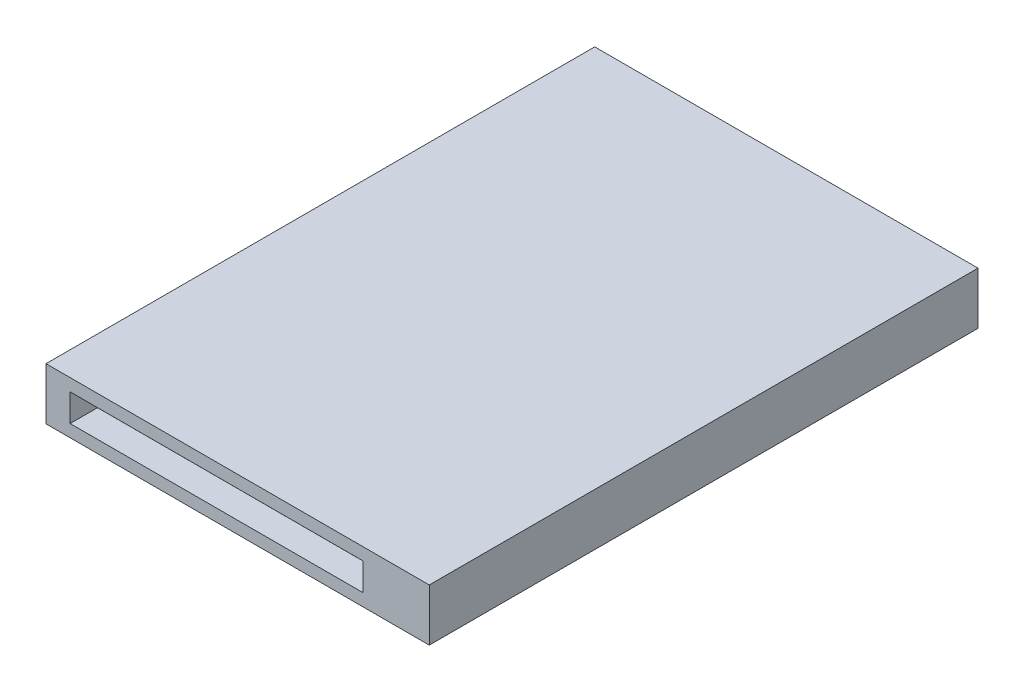
ISO-10303-21;
HEADER;
FILE_DESCRIPTION(('STEP AP214'),'2;1');
FILE_NAME('part.step','',(''),(''),'','','');
FILE_SCHEMA(('AUTOMOTIVE_DESIGN { 1 0 10303 214 1 1 1 1 }'));
ENDSEC;
DATA;
#1=APPLICATION_CONTEXT('core data for automotive mechanical design processes');
#2=APPLICATION_PROTOCOL_DEFINITION('international standard','automotive_design',2000,#1);
#3=PRODUCT_CONTEXT('',#1,'mechanical');
#4=PRODUCT('Part','Part','',(#3));
#5=PRODUCT_RELATED_PRODUCT_CATEGORY('part','',(#4));
#6=PRODUCT_DEFINITION_FORMATION('','',#4);
#7=PRODUCT_DEFINITION_CONTEXT('part definition',#1,'design');
#8=PRODUCT_DEFINITION('design','',#6,#7);
#9=PRODUCT_DEFINITION_SHAPE('','',#8);
#10=(LENGTH_UNIT() NAMED_UNIT(*) SI_UNIT(.MILLI.,.METRE.));
#11=(NAMED_UNIT(*) PLANE_ANGLE_UNIT() SI_UNIT($,.RADIAN.));
#12=(NAMED_UNIT(*) SI_UNIT($,.STERADIAN.) SOLID_ANGLE_UNIT());
#13=UNCERTAINTY_MEASURE_WITH_UNIT(LENGTH_MEASURE(1.E-05),#10,'distance_accuracy_value','');
#14=(GEOMETRIC_REPRESENTATION_CONTEXT(3) GLOBAL_UNCERTAINTY_ASSIGNED_CONTEXT((#13)) GLOBAL_UNIT_ASSIGNED_CONTEXT((#10,
#11,#12)) REPRESENTATION_CONTEXT('',''));
#15=CARTESIAN_POINT('',(0.,0.,0.));
#16=DIRECTION('',(0.,0.,1.));
#17=DIRECTION('',(1.,0.,0.));
#18=AXIS2_PLACEMENT_3D('',#15,#16,#17);
#19=CARTESIAN_POINT('',(-34.925,9.5,-50.));
#20=DIRECTION('',(1.,0.,0.));
#21=DIRECTION('',(0.,0.,-1.));
#22=AXIS2_PLACEMENT_3D('',#19,#20,#21);
#23=PLANE('',#22);
#24=DIRECTION('',(0.,0.,1.));
#25=VECTOR('',#24,1.);
#26=CARTESIAN_POINT('',(-34.925,0.,-50.));
#27=LINE('',#26,#25);
#28=CARTESIAN_POINT('',(-34.925,0.,-50.));
#29=VERTEX_POINT('',#28);
#30=CARTESIAN_POINT('',(-34.925,0.,50.));
#31=VERTEX_POINT('',#30);
#32=EDGE_CURVE('E141',#29,#31,#27,.T.);
#33=ORIENTED_EDGE('',*,*,#32,.T.);
#34=DIRECTION('',(0.,-1.,0.));
#35=VECTOR('',#34,1.);
#36=CARTESIAN_POINT('',(-34.925,9.5,50.));
#37=LINE('',#36,#35);
#38=CARTESIAN_POINT('',(-34.925,9.5,50.));
#39=VERTEX_POINT('',#38);
#40=EDGE_CURVE('E11',#39,#31,#37,.T.);
#41=ORIENTED_EDGE('',*,*,#40,.F.);
#42=DIRECTION('',(0.,0.,1.));
#43=VECTOR('',#42,1.);
#44=CARTESIAN_POINT('',(-34.925,9.5,-50.));
#45=LINE('',#44,#43);
#46=CARTESIAN_POINT('',(-34.925,9.5,-50.));
#47=VERTEX_POINT('',#46);
#48=EDGE_CURVE('E145',#47,#39,#45,.T.);
#49=ORIENTED_EDGE('',*,*,#48,.F.);
#50=DIRECTION('',(0.,-1.,0.));
#51=VECTOR('',#50,1.);
#52=CARTESIAN_POINT('',(-34.925,9.5,-50.));
#53=LINE('',#52,#51);
#54=EDGE_CURVE('E151',#47,#29,#53,.T.);
#55=ORIENTED_EDGE('',*,*,#54,.T.);
#56=EDGE_LOOP('',(#33,#41,#49,#55));
#57=FACE_BOUND('',#56,.T.);
#58=ADVANCED_FACE('F33',(#57),#23,.F.);
#59=CARTESIAN_POINT('',(-34.925,9.5,50.));
#60=DIRECTION('',(0.,0.,-1.));
#61=DIRECTION('',(-1.,0.,0.));
#62=AXIS2_PLACEMENT_3D('',#59,#60,#61);
#63=PLANE('',#62);
#64=DIRECTION('',(1.,0.,0.));
#65=VECTOR('',#64,1.);
#66=CARTESIAN_POINT('',(-30.5315149925693,2.24641577060966,50.));
#67=LINE('',#66,#65);
#68=CARTESIAN_POINT('',(-30.5315149925693,2.24641577060966,50.));
#69=VERTEX_POINT('',#68);
#70=CARTESIAN_POINT('',(22.8375732144418,2.24641577060966,50.));
#71=VERTEX_POINT('',#70);
#72=EDGE_CURVE('E135',#69,#71,#67,.T.);
#73=ORIENTED_EDGE('',*,*,#72,.F.);
#74=DIRECTION('',(0.,-1.,0.));
#75=VECTOR('',#74,1.);
#76=CARTESIAN_POINT('',(-30.5315149925693,7.25358422939103,50.));
#77=LINE('',#76,#75);
#78=CARTESIAN_POINT('',(-30.5315149925693,7.25358422939103,50.));
#79=VERTEX_POINT('',#78);
#80=EDGE_CURVE('E47',#79,#69,#77,.T.);
#81=ORIENTED_EDGE('',*,*,#80,.F.);
#82=DIRECTION('',(-1.,0.,0.));
#83=VECTOR('',#82,1.);
#84=CARTESIAN_POINT('',(-30.5315149925693,7.25358422939103,50.));
#85=LINE('',#84,#83);
#86=CARTESIAN_POINT('',(22.8375732144418,7.25358422939103,50.));
#87=VERTEX_POINT('',#86);
#88=EDGE_CURVE('E126',#87,#79,#85,.T.);
#89=ORIENTED_EDGE('',*,*,#88,.F.);
#90=DIRECTION('',(0.,1.,0.));
#91=VECTOR('',#90,1.);
#92=CARTESIAN_POINT('',(22.8375732144418,7.25358422939103,50.));
#93=LINE('',#92,#91);
#94=EDGE_CURVE('E129',#71,#87,#93,.T.);
#95=ORIENTED_EDGE('',*,*,#94,.F.);
#96=EDGE_LOOP('',(#73,#81,#89,#95));
#97=FACE_BOUND('',#96,.T.);
#98=DIRECTION('',(1.,0.,0.));
#99=VECTOR('',#98,1.);
#100=CARTESIAN_POINT('',(-34.925,0.,50.));
#101=LINE('',#100,#99);
#102=CARTESIAN_POINT('',(34.925,0.,50.));
#103=VERTEX_POINT('',#102);
#104=EDGE_CURVE('E154',#31,#103,#101,.T.);
#105=ORIENTED_EDGE('',*,*,#104,.T.);
#106=DIRECTION('',(0.,-1.,0.));
#107=VECTOR('',#106,1.);
#108=CARTESIAN_POINT('',(34.925,9.5,50.));
#109=LINE('',#108,#107);
#110=CARTESIAN_POINT('',(34.925,9.5,50.));
#111=VERTEX_POINT('',#110);
#112=EDGE_CURVE('E40',#111,#103,#109,.T.);
#113=ORIENTED_EDGE('',*,*,#112,.F.);
#114=DIRECTION('',(1.,0.,0.));
#115=VECTOR('',#114,1.);
#116=CARTESIAN_POINT('',(-34.925,9.5,50.));
#117=LINE('',#116,#115);
#118=EDGE_CURVE('E84',#39,#111,#117,.T.);
#119=ORIENTED_EDGE('',*,*,#118,.F.);
#120=ORIENTED_EDGE('',*,*,#40,.T.);
#121=EDGE_LOOP('',(#105,#113,#119,#120));
#122=FACE_BOUND('',#121,.T.);
#123=ADVANCED_FACE('F182',(#97,#122),#63,.F.);
#124=CARTESIAN_POINT('',(34.925,9.5,-50.));
#125=DIRECTION('',(-1.,0.,0.));
#126=DIRECTION('',(0.,0.,1.));
#127=AXIS2_PLACEMENT_3D('',#124,#125,#126);
#128=PLANE('',#127);
#129=DIRECTION('',(0.,0.,-1.));
#130=VECTOR('',#129,1.);
#131=CARTESIAN_POINT('',(34.925,0.,-50.));
#132=LINE('',#131,#130);
#133=CARTESIAN_POINT('',(34.925,0.,-50.));
#134=VERTEX_POINT('',#133);
#135=EDGE_CURVE('E156',#103,#134,#132,.T.);
#136=ORIENTED_EDGE('',*,*,#135,.T.);
#137=DIRECTION('',(0.,-1.,0.));
#138=VECTOR('',#137,1.);
#139=CARTESIAN_POINT('',(34.925,9.5,-50.));
#140=LINE('',#139,#138);
#141=CARTESIAN_POINT('',(34.925,9.5,-50.));
#142=VERTEX_POINT('',#141);
#143=EDGE_CURVE('E160',#142,#134,#140,.T.);
#144=ORIENTED_EDGE('',*,*,#143,.F.);
#145=DIRECTION('',(0.,0.,-1.));
#146=VECTOR('',#145,1.);
#147=CARTESIAN_POINT('',(34.925,9.5,-50.));
#148=LINE('',#147,#146);
#149=EDGE_CURVE('E148',#111,#142,#148,.T.);
#150=ORIENTED_EDGE('',*,*,#149,.F.);
#151=ORIENTED_EDGE('',*,*,#112,.T.);
#152=EDGE_LOOP('',(#136,#144,#150,#151));
#153=FACE_BOUND('',#152,.T.);
#154=ADVANCED_FACE('F165',(#153),#128,.F.);
#155=CARTESIAN_POINT('',(-34.925,9.5,-50.));
#156=DIRECTION('',(0.,0.,1.));
#157=DIRECTION('',(1.,0.,0.));
#158=AXIS2_PLACEMENT_3D('',#155,#156,#157);
#159=PLANE('',#158);
#160=DIRECTION('',(-1.,0.,0.));
#161=VECTOR('',#160,1.);
#162=CARTESIAN_POINT('',(-34.925,0.,-50.));
#163=LINE('',#162,#161);
#164=EDGE_CURVE('E77',#134,#29,#163,.T.);
#165=ORIENTED_EDGE('',*,*,#164,.T.);
#166=ORIENTED_EDGE('',*,*,#54,.F.);
#167=DIRECTION('',(-1.,0.,0.));
#168=VECTOR('',#167,1.);
#169=CARTESIAN_POINT('',(-34.925,9.5,-50.));
#170=LINE('',#169,#168);
#171=EDGE_CURVE('E56',#142,#47,#170,.T.);
#172=ORIENTED_EDGE('',*,*,#171,.F.);
#173=ORIENTED_EDGE('',*,*,#143,.T.);
#174=EDGE_LOOP('',(#165,#166,#172,#173));
#175=FACE_BOUND('',#174,.T.);
#176=ADVANCED_FACE('F173',(#175),#159,.F.);
#177=CARTESIAN_POINT('',(-34.925,9.5,50.));
#178=DIRECTION('',(0.,1.,0.));
#179=DIRECTION('',(0.,0.,1.));
#180=AXIS2_PLACEMENT_3D('',#177,#178,#179);
#181=PLANE('',#180);
#182=ORIENTED_EDGE('',*,*,#48,.T.);
#183=ORIENTED_EDGE('',*,*,#118,.T.);
#184=ORIENTED_EDGE('',*,*,#149,.T.);
#185=ORIENTED_EDGE('',*,*,#171,.T.);
#186=EDGE_LOOP('',(#182,#183,#184,#185));
#187=FACE_BOUND('',#186,.T.);
#188=ADVANCED_FACE('F175',(#187),#181,.T.);
#189=CARTESIAN_POINT('',(-34.925,0.,50.));
#190=DIRECTION('',(0.,1.,0.));
#191=DIRECTION('',(0.,0.,1.));
#192=AXIS2_PLACEMENT_3D('',#189,#190,#191);
#193=PLANE('',#192);
#194=ORIENTED_EDGE('',*,*,#32,.F.);
#195=ORIENTED_EDGE('',*,*,#164,.F.);
#196=ORIENTED_EDGE('',*,*,#135,.F.);
#197=ORIENTED_EDGE('',*,*,#104,.F.);
#198=EDGE_LOOP('',(#194,#195,#196,#197));
#199=FACE_BOUND('',#198,.T.);
#200=ADVANCED_FACE('F169',(#199),#193,.F.);
#201=CARTESIAN_POINT('',(-30.5315149925693,7.25358422939103,45.));
#202=DIRECTION('',(-1.,0.,0.));
#203=DIRECTION('',(0.,0.,1.));
#204=AXIS2_PLACEMENT_3D('',#201,#202,#203);
#205=PLANE('',#204);
#206=ORIENTED_EDGE('',*,*,#80,.T.);
#207=DIRECTION('',(0.,0.,1.));
#208=VECTOR('',#207,1.);
#209=CARTESIAN_POINT('',(-30.5315149925693,2.24641577060966,45.));
#210=LINE('',#209,#208);
#211=CARTESIAN_POINT('',(-30.5315149925693,2.24641577060966,45.));
#212=VERTEX_POINT('',#211);
#213=EDGE_CURVE('E104',#212,#69,#210,.T.);
#214=ORIENTED_EDGE('',*,*,#213,.F.);
#215=DIRECTION('',(0.,-1.,0.));
#216=VECTOR('',#215,1.);
#217=CARTESIAN_POINT('',(-30.5315149925693,7.25358422939103,45.));
#218=LINE('',#217,#216);
#219=CARTESIAN_POINT('',(-30.5315149925693,7.25358422939103,45.));
#220=VERTEX_POINT('',#219);
#221=EDGE_CURVE('E108',#220,#212,#218,.T.);
#222=ORIENTED_EDGE('',*,*,#221,.F.);
#223=DIRECTION('',(0.,0.,1.));
#224=VECTOR('',#223,1.);
#225=CARTESIAN_POINT('',(-30.5315149925693,7.25358422939103,45.));
#226=LINE('',#225,#224);
#227=EDGE_CURVE('E139',#220,#79,#226,.T.);
#228=ORIENTED_EDGE('',*,*,#227,.T.);
#229=EDGE_LOOP('',(#206,#214,#222,#228));
#230=FACE_BOUND('',#229,.T.);
#231=ADVANCED_FACE('F106',(#230),#205,.F.);
#232=CARTESIAN_POINT('',(-30.5315149925693,7.25358422939103,45.));
#233=DIRECTION('',(0.,1.,0.));
#234=DIRECTION('',(0.,0.,1.));
#235=AXIS2_PLACEMENT_3D('',#232,#233,#234);
#236=PLANE('',#235);
#237=ORIENTED_EDGE('',*,*,#88,.T.);
#238=ORIENTED_EDGE('',*,*,#227,.F.);
#239=DIRECTION('',(-1.,0.,0.));
#240=VECTOR('',#239,1.);
#241=CARTESIAN_POINT('',(-30.5315149925693,7.25358422939103,45.));
#242=LINE('',#241,#240);
#243=CARTESIAN_POINT('',(22.8375732144418,7.25358422939103,45.));
#244=VERTEX_POINT('',#243);
#245=EDGE_CURVE('E114',#244,#220,#242,.T.);
#246=ORIENTED_EDGE('',*,*,#245,.F.);
#247=DIRECTION('',(0.,0.,1.));
#248=VECTOR('',#247,1.);
#249=CARTESIAN_POINT('',(22.8375732144418,7.25358422939103,45.));
#250=LINE('',#249,#248);
#251=EDGE_CURVE('E142',#244,#87,#250,.T.);
#252=ORIENTED_EDGE('',*,*,#251,.T.);
#253=EDGE_LOOP('',(#237,#238,#246,#252));
#254=FACE_BOUND('',#253,.T.);
#255=ADVANCED_FACE('F199',(#254),#236,.F.);
#256=CARTESIAN_POINT('',(22.8375732144418,7.25358422939103,45.));
#257=DIRECTION('',(1.,0.,0.));
#258=DIRECTION('',(0.,0.,-1.));
#259=AXIS2_PLACEMENT_3D('',#256,#257,#258);
#260=PLANE('',#259);
#261=ORIENTED_EDGE('',*,*,#94,.T.);
#262=ORIENTED_EDGE('',*,*,#251,.F.);
#263=DIRECTION('',(0.,1.,0.));
#264=VECTOR('',#263,1.);
#265=CARTESIAN_POINT('',(22.8375732144418,7.25358422939103,45.));
#266=LINE('',#265,#264);
#267=CARTESIAN_POINT('',(22.8375732144418,2.24641577060966,45.));
#268=VERTEX_POINT('',#267);
#269=EDGE_CURVE('E122',#268,#244,#266,.T.);
#270=ORIENTED_EDGE('',*,*,#269,.F.);
#271=DIRECTION('',(0.,0.,1.));
#272=VECTOR('',#271,1.);
#273=CARTESIAN_POINT('',(22.8375732144418,2.24641577060966,45.));
#274=LINE('',#273,#272);
#275=EDGE_CURVE('E113',#268,#71,#274,.T.);
#276=ORIENTED_EDGE('',*,*,#275,.T.);
#277=EDGE_LOOP('',(#261,#262,#270,#276));
#278=FACE_BOUND('',#277,.T.);
#279=ADVANCED_FACE('F197',(#278),#260,.F.);
#280=CARTESIAN_POINT('',(-30.5315149925693,2.24641577060966,45.));
#281=DIRECTION('',(0.,-1.,0.));
#282=DIRECTION('',(0.,0.,-1.));
#283=AXIS2_PLACEMENT_3D('',#280,#281,#282);
#284=PLANE('',#283);
#285=ORIENTED_EDGE('',*,*,#72,.T.);
#286=ORIENTED_EDGE('',*,*,#275,.F.);
#287=DIRECTION('',(1.,0.,0.));
#288=VECTOR('',#287,1.);
#289=CARTESIAN_POINT('',(-30.5315149925693,2.24641577060966,45.));
#290=LINE('',#289,#288);
#291=EDGE_CURVE('E117',#212,#268,#290,.T.);
#292=ORIENTED_EDGE('',*,*,#291,.F.);
#293=ORIENTED_EDGE('',*,*,#213,.T.);
#294=EDGE_LOOP('',(#285,#286,#292,#293));
#295=FACE_BOUND('',#294,.T.);
#296=ADVANCED_FACE('F118',(#295),#284,.F.);
#297=CARTESIAN_POINT('',(-30.5315149925693,2.24641577060966,45.));
#298=DIRECTION('',(0.,0.,1.));
#299=DIRECTION('',(1.,0.,0.));
#300=AXIS2_PLACEMENT_3D('',#297,#298,#299);
#301=PLANE('',#300);
#302=ORIENTED_EDGE('',*,*,#221,.T.);
#303=ORIENTED_EDGE('',*,*,#291,.T.);
#304=ORIENTED_EDGE('',*,*,#269,.T.);
#305=ORIENTED_EDGE('',*,*,#245,.T.);
#306=EDGE_LOOP('',(#302,#303,#304,#305));
#307=FACE_BOUND('',#306,.T.);
#308=ADVANCED_FACE('F124',(#307),#301,.T.);
#309=CLOSED_SHELL('',(#58,#123,#154,#176,#188,#200,#231,#255,#279,#296,#308));
#310=MANIFOLD_SOLID_BREP('B2',#309);
#311=ADVANCED_BREP_SHAPE_REPRESENTATION('',(#18,#310),#14);
#312=SHAPE_DEFINITION_REPRESENTATION(#9,#311);
ENDSEC;
END-ISO-10303-21;
